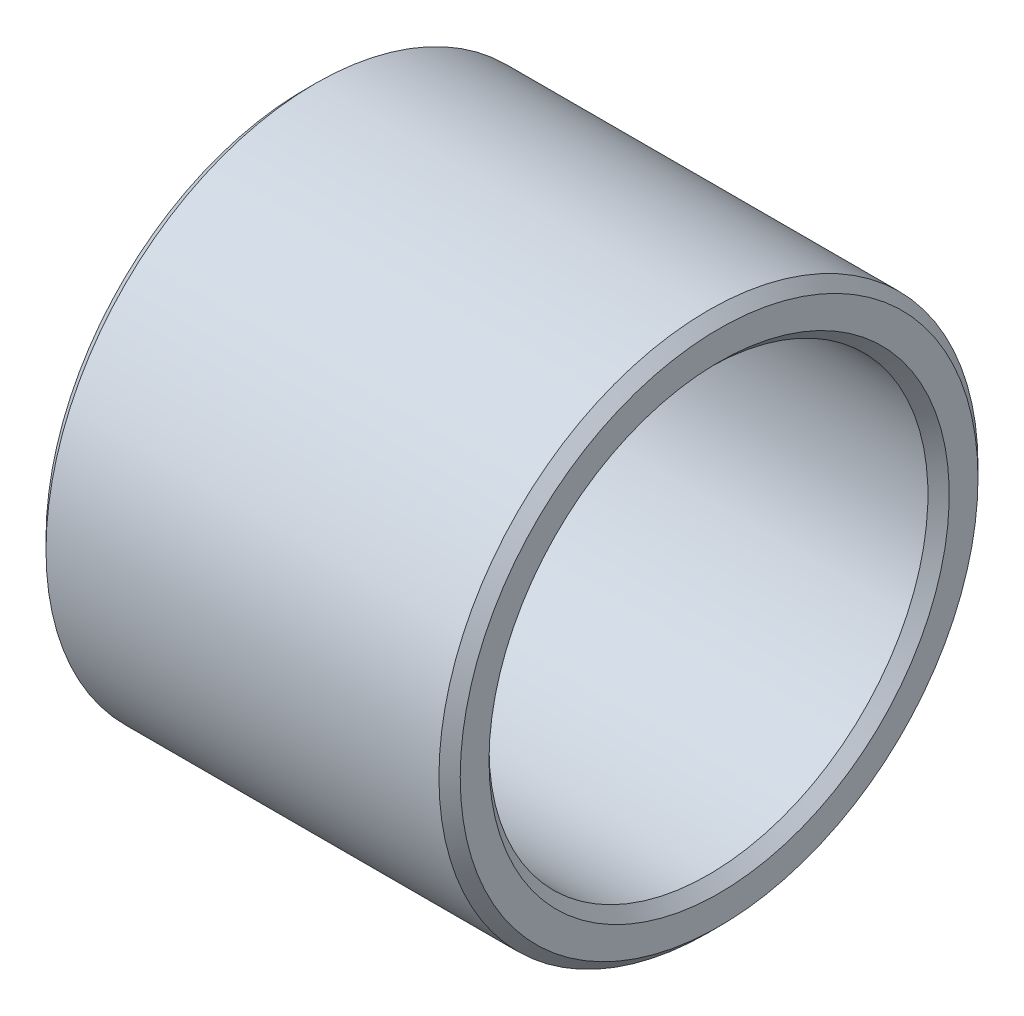
ISO-10303-21;
HEADER;
FILE_DESCRIPTION(('STEP AP214'),'2;1');
FILE_NAME('part.step','',(''),(''),'','','');
FILE_SCHEMA(('AUTOMOTIVE_DESIGN { 1 0 10303 214 1 1 1 1 }'));
ENDSEC;
DATA;
#1=APPLICATION_CONTEXT('core data for automotive mechanical design processes');
#2=APPLICATION_PROTOCOL_DEFINITION('international standard','automotive_design',2000,#1);
#3=PRODUCT_CONTEXT('',#1,'mechanical');
#4=PRODUCT('Part','Part','',(#3));
#5=PRODUCT_RELATED_PRODUCT_CATEGORY('part','',(#4));
#6=PRODUCT_DEFINITION_FORMATION('','',#4);
#7=PRODUCT_DEFINITION_CONTEXT('part definition',#1,'design');
#8=PRODUCT_DEFINITION('design','',#6,#7);
#9=PRODUCT_DEFINITION_SHAPE('','',#8);
#10=(LENGTH_UNIT() NAMED_UNIT(*) SI_UNIT(.MILLI.,.METRE.));
#11=(NAMED_UNIT(*) PLANE_ANGLE_UNIT() SI_UNIT($,.RADIAN.));
#12=(NAMED_UNIT(*) SI_UNIT($,.STERADIAN.) SOLID_ANGLE_UNIT());
#13=UNCERTAINTY_MEASURE_WITH_UNIT(LENGTH_MEASURE(1.E-05),#10,'distance_accuracy_value','');
#14=(GEOMETRIC_REPRESENTATION_CONTEXT(3) GLOBAL_UNCERTAINTY_ASSIGNED_CONTEXT((#13)) GLOBAL_UNIT_ASSIGNED_CONTEXT((#10,
#11,#12)) REPRESENTATION_CONTEXT('',''));
#15=CARTESIAN_POINT('',(0.,0.,0.));
#16=DIRECTION('',(0.,0.,1.));
#17=DIRECTION('',(1.,0.,0.));
#18=AXIS2_PLACEMENT_3D('',#15,#16,#17);
#19=CARTESIAN_POINT('',(-10.6550847457627,0.,0.));
#20=DIRECTION('',(-1.,0.,0.));
#21=DIRECTION('',(0.,0.,1.));
#22=AXIS2_PLACEMENT_3D('',#19,#20,#21);
#23=CYLINDRICAL_SURFACE('',#22,12.65);
#24=CARTESIAN_POINT('',(0.499999999999999,0.,0.));
#25=DIRECTION('',(-1.,0.,0.));
#26=DIRECTION('',(0.,0.,1.));
#27=AXIS2_PLACEMENT_3D('',#24,#25,#26);
#28=CIRCLE('',#27,12.65);
#29=CARTESIAN_POINT('',(0.499999999999999,0.,12.65));
#30=VERTEX_POINT('',#29);
#31=EDGE_CURVE('E58',#30,#30,#28,.T.);
#32=ORIENTED_EDGE('',*,*,#31,.F.);
#33=EDGE_LOOP('',(#32));
#34=FACE_BOUND('',#33,.T.);
#35=CARTESIAN_POINT('',(18.94,0.,0.));
#36=DIRECTION('',(-1.,0.,0.));
#37=DIRECTION('',(0.,0.,1.));
#38=AXIS2_PLACEMENT_3D('',#35,#36,#37);
#39=CIRCLE('',#38,12.65);
#40=CARTESIAN_POINT('',(18.94,0.,12.65));
#41=VERTEX_POINT('',#40);
#42=EDGE_CURVE('E10',#41,#41,#39,.T.);
#43=ORIENTED_EDGE('',*,*,#42,.T.);
#44=EDGE_LOOP('',(#43));
#45=FACE_BOUND('',#44,.T.);
#46=ADVANCED_FACE('F30',(#34,#45),#23,.T.);
#47=CARTESIAN_POINT('',(19.44,0.,0.));
#48=DIRECTION('',(-1.,0.,0.));
#49=DIRECTION('',(0.,0.,1.));
#50=AXIS2_PLACEMENT_3D('',#47,#48,#49);
#51=CONICAL_SURFACE('',#50,12.15,0.785398163397447);
#52=ORIENTED_EDGE('',*,*,#42,.F.);
#53=EDGE_LOOP('',(#52));
#54=FACE_BOUND('',#53,.T.);
#55=CARTESIAN_POINT('',(19.44,0.,0.));
#56=DIRECTION('',(-1.,0.,0.));
#57=DIRECTION('',(0.,0.,1.));
#58=AXIS2_PLACEMENT_3D('',#55,#56,#57);
#59=CIRCLE('',#58,12.15);
#60=CARTESIAN_POINT('',(19.44,0.,12.15));
#61=VERTEX_POINT('',#60);
#62=EDGE_CURVE('E36',#61,#61,#59,.T.);
#63=ORIENTED_EDGE('',*,*,#62,.T.);
#64=EDGE_LOOP('',(#63));
#65=FACE_BOUND('',#64,.T.);
#66=ADVANCED_FACE('F65',(#54,#65),#51,.T.);
#67=CARTESIAN_POINT('',(19.44,12.15,0.));
#68=DIRECTION('',(-1.,0.,0.));
#69=DIRECTION('',(0.,0.,1.));
#70=AXIS2_PLACEMENT_3D('',#67,#68,#69);
#71=PLANE('',#70);
#72=ORIENTED_EDGE('',*,*,#62,.F.);
#73=EDGE_LOOP('',(#72));
#74=FACE_BOUND('',#73,.T.);
#75=CARTESIAN_POINT('',(19.44,0.,0.));
#76=DIRECTION('',(-1.,0.,0.));
#77=DIRECTION('',(0.,0.,1.));
#78=AXIS2_PLACEMENT_3D('',#75,#76,#77);
#79=CIRCLE('',#78,10.8);
#80=CARTESIAN_POINT('',(19.44,0.,10.8));
#81=VERTEX_POINT('',#80);
#82=EDGE_CURVE('E40',#81,#81,#79,.T.);
#83=ORIENTED_EDGE('',*,*,#82,.T.);
#84=EDGE_LOOP('',(#83));
#85=FACE_BOUND('',#84,.T.);
#86=ADVANCED_FACE('F69',(#74,#85),#71,.F.);
#87=CARTESIAN_POINT('',(18.94,0.,0.));
#88=DIRECTION('',(1.,0.,0.));
#89=DIRECTION('',(0.,0.,-1.));
#90=AXIS2_PLACEMENT_3D('',#87,#88,#89);
#91=CONICAL_SURFACE('',#90,10.3,0.785398163397448);
#92=ORIENTED_EDGE('',*,*,#82,.F.);
#93=EDGE_LOOP('',(#92));
#94=FACE_BOUND('',#93,.T.);
#95=CARTESIAN_POINT('',(18.94,0.,0.));
#96=DIRECTION('',(-1.,0.,0.));
#97=DIRECTION('',(0.,0.,1.));
#98=AXIS2_PLACEMENT_3D('',#95,#96,#97);
#99=CIRCLE('',#98,10.3);
#100=CARTESIAN_POINT('',(18.94,0.,10.3));
#101=VERTEX_POINT('',#100);
#102=EDGE_CURVE('E44',#101,#101,#99,.T.);
#103=ORIENTED_EDGE('',*,*,#102,.T.);
#104=EDGE_LOOP('',(#103));
#105=FACE_BOUND('',#104,.T.);
#106=ADVANCED_FACE('F74',(#94,#105),#91,.F.);
#107=CARTESIAN_POINT('',(-10.6550847457627,0.,0.));
#108=DIRECTION('',(-1.,0.,0.));
#109=DIRECTION('',(0.,0.,1.));
#110=AXIS2_PLACEMENT_3D('',#107,#108,#109);
#111=CYLINDRICAL_SURFACE('',#110,10.3);
#112=ORIENTED_EDGE('',*,*,#102,.F.);
#113=EDGE_LOOP('',(#112));
#114=FACE_BOUND('',#113,.T.);
#115=CARTESIAN_POINT('',(0.5,0.,0.));
#116=DIRECTION('',(-1.,0.,0.));
#117=DIRECTION('',(0.,0.,1.));
#118=AXIS2_PLACEMENT_3D('',#115,#116,#117);
#119=CIRCLE('',#118,10.3);
#120=CARTESIAN_POINT('',(0.5,0.,10.3));
#121=VERTEX_POINT('',#120);
#122=EDGE_CURVE('E49',#121,#121,#119,.T.);
#123=ORIENTED_EDGE('',*,*,#122,.T.);
#124=EDGE_LOOP('',(#123));
#125=FACE_BOUND('',#124,.T.);
#126=ADVANCED_FACE('F80',(#114,#125),#111,.F.);
#127=CARTESIAN_POINT('',(0.,0.,0.));
#128=DIRECTION('',(-1.,0.,0.));
#129=DIRECTION('',(0.,0.,1.));
#130=AXIS2_PLACEMENT_3D('',#127,#128,#129);
#131=CONICAL_SURFACE('',#130,10.8,0.785398163397448);
#132=ORIENTED_EDGE('',*,*,#122,.F.);
#133=EDGE_LOOP('',(#132));
#134=FACE_BOUND('',#133,.T.);
#135=CARTESIAN_POINT('',(0.,0.,0.));
#136=DIRECTION('',(-1.,0.,0.));
#137=DIRECTION('',(0.,0.,1.));
#138=AXIS2_PLACEMENT_3D('',#135,#136,#137);
#139=CIRCLE('',#138,10.8);
#140=CARTESIAN_POINT('',(0.,0.,10.8));
#141=VERTEX_POINT('',#140);
#142=EDGE_CURVE('E52',#141,#141,#139,.T.);
#143=ORIENTED_EDGE('',*,*,#142,.T.);
#144=EDGE_LOOP('',(#143));
#145=FACE_BOUND('',#144,.T.);
#146=ADVANCED_FACE('F84',(#134,#145),#131,.F.);
#147=CARTESIAN_POINT('',(0.,12.15,0.));
#148=DIRECTION('',(1.,0.,0.));
#149=DIRECTION('',(0.,0.,-1.));
#150=AXIS2_PLACEMENT_3D('',#147,#148,#149);
#151=PLANE('',#150);
#152=ORIENTED_EDGE('',*,*,#142,.F.);
#153=EDGE_LOOP('',(#152));
#154=FACE_BOUND('',#153,.T.);
#155=CARTESIAN_POINT('',(0.,0.,0.));
#156=DIRECTION('',(-1.,0.,0.));
#157=DIRECTION('',(0.,0.,1.));
#158=AXIS2_PLACEMENT_3D('',#155,#156,#157);
#159=CIRCLE('',#158,12.15);
#160=CARTESIAN_POINT('',(0.,0.,12.15));
#161=VERTEX_POINT('',#160);
#162=EDGE_CURVE('E55',#161,#161,#159,.T.);
#163=ORIENTED_EDGE('',*,*,#162,.T.);
#164=EDGE_LOOP('',(#163));
#165=FACE_BOUND('',#164,.T.);
#166=ADVANCED_FACE('F88',(#154,#165),#151,.F.);
#167=CARTESIAN_POINT('',(0.499999999999999,0.,0.));
#168=DIRECTION('',(1.,0.,0.));
#169=DIRECTION('',(0.,0.,-1.));
#170=AXIS2_PLACEMENT_3D('',#167,#168,#169);
#171=CONICAL_SURFACE('',#170,12.65,0.78539816339745);
#172=ORIENTED_EDGE('',*,*,#162,.F.);
#173=EDGE_LOOP('',(#172));
#174=FACE_BOUND('',#173,.T.);
#175=ORIENTED_EDGE('',*,*,#31,.T.);
#176=EDGE_LOOP('',(#175));
#177=FACE_BOUND('',#176,.T.);
#178=ADVANCED_FACE('F62',(#174,#177),#171,.T.);
#179=CLOSED_SHELL('',(#46,#66,#86,#106,#126,#146,#166,#178));
#180=MANIFOLD_SOLID_BREP('B2',#179);
#181=ADVANCED_BREP_SHAPE_REPRESENTATION('',(#18,#180),#14);
#182=SHAPE_DEFINITION_REPRESENTATION(#9,#181);
ENDSEC;
END-ISO-10303-21;
